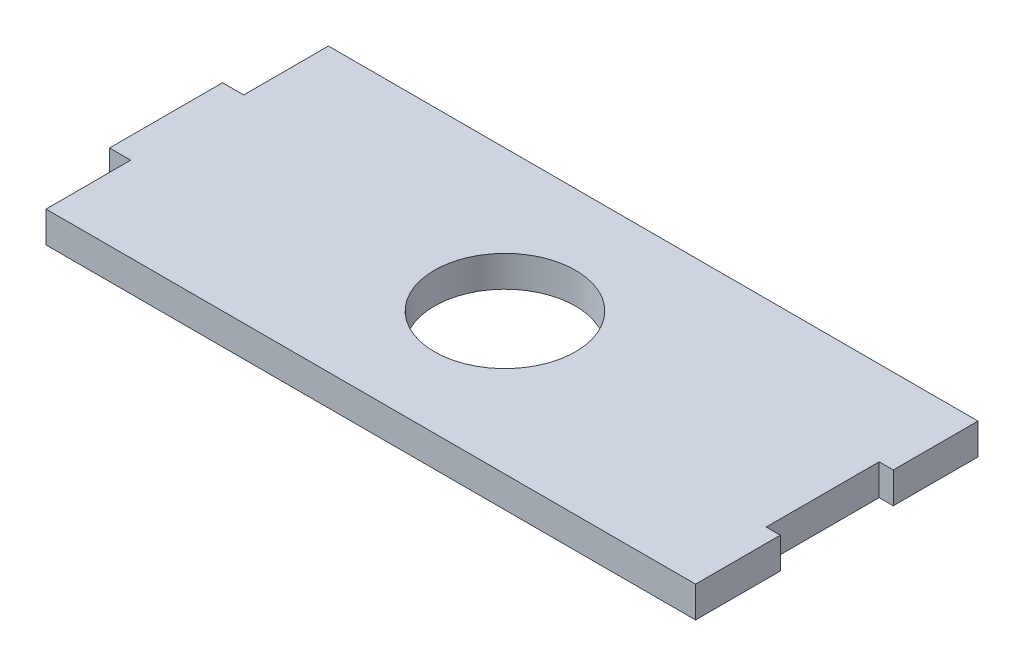
ISO-10303-21;
HEADER;
FILE_DESCRIPTION(('STEP AP214'),'2;1');
FILE_NAME('part.step','',(''),(''),'','','');
FILE_SCHEMA(('AUTOMOTIVE_DESIGN { 1 0 10303 214 1 1 1 1 }'));
ENDSEC;
DATA;
#1=APPLICATION_CONTEXT('core data for automotive mechanical design processes');
#2=APPLICATION_PROTOCOL_DEFINITION('international standard','automotive_design',2000,#1);
#3=PRODUCT_CONTEXT('',#1,'mechanical');
#4=PRODUCT('Part','Part','',(#3));
#5=PRODUCT_RELATED_PRODUCT_CATEGORY('part','',(#4));
#6=PRODUCT_DEFINITION_FORMATION('','',#4);
#7=PRODUCT_DEFINITION_CONTEXT('part definition',#1,'design');
#8=PRODUCT_DEFINITION('design','',#6,#7);
#9=PRODUCT_DEFINITION_SHAPE('','',#8);
#10=(LENGTH_UNIT() NAMED_UNIT(*) SI_UNIT(.MILLI.,.METRE.));
#11=(NAMED_UNIT(*) PLANE_ANGLE_UNIT() SI_UNIT($,.RADIAN.));
#12=(NAMED_UNIT(*) SI_UNIT($,.STERADIAN.) SOLID_ANGLE_UNIT());
#13=UNCERTAINTY_MEASURE_WITH_UNIT(LENGTH_MEASURE(1.E-05),#10,'distance_accuracy_value','');
#14=(GEOMETRIC_REPRESENTATION_CONTEXT(3) GLOBAL_UNCERTAINTY_ASSIGNED_CONTEXT((#13)) GLOBAL_UNIT_ASSIGNED_CONTEXT((#10,
#11,#12)) REPRESENTATION_CONTEXT('',''));
#15=CARTESIAN_POINT('',(0.,0.,0.));
#16=DIRECTION('',(0.,0.,1.));
#17=DIRECTION('',(1.,0.,0.));
#18=AXIS2_PLACEMENT_3D('',#15,#16,#17);
#19=CARTESIAN_POINT('',(0.,2.2,-30.5977127156326));
#20=DIRECTION('',(0.,0.,1.));
#21=DIRECTION('',(1.,0.,0.));
#22=AXIS2_PLACEMENT_3D('',#19,#20,#21);
#23=PLANE('',#22);
#24=DIRECTION('',(-1.,0.,0.));
#25=VECTOR('',#24,1.);
#26=CARTESIAN_POINT('',(0.,0.,-30.5977127156326));
#27=LINE('',#26,#25);
#28=CARTESIAN_POINT('',(-91.3045745686273,0.,-30.5977127156326));
#29=VERTEX_POINT('',#28);
#30=CARTESIAN_POINT('',(-92.3045745686274,0.,-30.5977127156326));
#31=VERTEX_POINT('',#30);
#32=EDGE_CURVE('E159',#29,#31,#27,.T.);
#33=ORIENTED_EDGE('',*,*,#32,.F.);
#34=DIRECTION('',(0.,-1.,0.));
#35=VECTOR('',#34,1.);
#36=CARTESIAN_POINT('',(-91.3045745686273,2.2,-30.5977127156326));
#37=LINE('',#36,#35);
#38=CARTESIAN_POINT('',(-91.3045745686273,2.2,-30.5977127156326));
#39=VERTEX_POINT('',#38);
#40=EDGE_CURVE('E11',#39,#29,#37,.T.);
#41=ORIENTED_EDGE('',*,*,#40,.F.);
#42=DIRECTION('',(-1.,0.,0.));
#43=VECTOR('',#42,1.);
#44=CARTESIAN_POINT('',(0.,2.2,-30.5977127156326));
#45=LINE('',#44,#43);
#46=CARTESIAN_POINT('',(-92.3045745686274,2.2,-30.5977127156326));
#47=VERTEX_POINT('',#46);
#48=EDGE_CURVE('E191',#39,#47,#45,.T.);
#49=ORIENTED_EDGE('',*,*,#48,.T.);
#50=DIRECTION('',(0.,-1.,0.));
#51=VECTOR('',#50,1.);
#52=CARTESIAN_POINT('',(-92.3045745686274,2.2,-30.5977127156326));
#53=LINE('',#52,#51);
#54=EDGE_CURVE('E53',#47,#31,#53,.T.);
#55=ORIENTED_EDGE('',*,*,#54,.T.);
#56=EDGE_LOOP('',(#33,#41,#49,#55));
#57=FACE_BOUND('',#56,.T.);
#58=ADVANCED_FACE('F37',(#57),#23,.T.);
#59=CARTESIAN_POINT('',(-91.3045745686277,2.2,-1.01368440939695E-12));
#60=DIRECTION('',(1.,0.,0.));
#61=DIRECTION('',(0.,0.,-1.));
#62=AXIS2_PLACEMENT_3D('',#59,#60,#61);
#63=PLANE('',#62);
#64=DIRECTION('',(0.,0.,1.));
#65=VECTOR('',#64,1.);
#66=CARTESIAN_POINT('',(-91.3045745686277,0.,-1.01368440939695E-12));
#67=LINE('',#66,#65);
#68=CARTESIAN_POINT('',(-91.3045745686274,0.,-36.5977127156591));
#69=VERTEX_POINT('',#68);
#70=EDGE_CURVE('E161',#69,#29,#67,.T.);
#71=ORIENTED_EDGE('',*,*,#70,.F.);
#72=DIRECTION('',(0.,-1.,0.));
#73=VECTOR('',#72,1.);
#74=CARTESIAN_POINT('',(-91.3045745686274,2.2,-36.5977127156591));
#75=LINE('',#74,#73);
#76=CARTESIAN_POINT('',(-91.3045745686274,2.2,-36.5977127156591));
#77=VERTEX_POINT('',#76);
#78=EDGE_CURVE('E45',#77,#69,#75,.T.);
#79=ORIENTED_EDGE('',*,*,#78,.F.);
#80=DIRECTION('',(0.,0.,1.));
#81=VECTOR('',#80,1.);
#82=CARTESIAN_POINT('',(-91.3045745686277,2.2,-1.01368440939695E-12));
#83=LINE('',#82,#81);
#84=EDGE_CURVE('E148',#77,#39,#83,.T.);
#85=ORIENTED_EDGE('',*,*,#84,.T.);
#86=ORIENTED_EDGE('',*,*,#40,.T.);
#87=EDGE_LOOP('',(#71,#79,#85,#86));
#88=FACE_BOUND('',#87,.T.);
#89=ADVANCED_FACE('F218',(#88),#63,.T.);
#90=CARTESIAN_POINT('',(0.,2.2,-36.5977127156591));
#91=DIRECTION('',(0.,0.,-1.));
#92=DIRECTION('',(-1.,0.,0.));
#93=AXIS2_PLACEMENT_3D('',#90,#91,#92);
#94=PLANE('',#93);
#95=DIRECTION('',(1.,0.,0.));
#96=VECTOR('',#95,1.);
#97=CARTESIAN_POINT('',(0.,0.,-36.5977127156591));
#98=LINE('',#97,#96);
#99=CARTESIAN_POINT('',(-137.30457456867,0.,-36.5977127156591));
#100=VERTEX_POINT('',#99);
#101=EDGE_CURVE('E164',#100,#69,#98,.T.);
#102=ORIENTED_EDGE('',*,*,#101,.F.);
#103=DIRECTION('',(0.,-1.,0.));
#104=VECTOR('',#103,1.);
#105=CARTESIAN_POINT('',(-137.30457456867,2.2,-36.5977127156591));
#106=LINE('',#105,#104);
#107=CARTESIAN_POINT('',(-137.30457456867,2.2,-36.5977127156591));
#108=VERTEX_POINT('',#107);
#109=EDGE_CURVE('E207',#108,#100,#106,.T.);
#110=ORIENTED_EDGE('',*,*,#109,.F.);
#111=DIRECTION('',(1.,0.,0.));
#112=VECTOR('',#111,1.);
#113=CARTESIAN_POINT('',(0.,2.2,-36.5977127156591));
#114=LINE('',#113,#112);
#115=EDGE_CURVE('E214',#108,#77,#114,.T.);
#116=ORIENTED_EDGE('',*,*,#115,.T.);
#117=ORIENTED_EDGE('',*,*,#78,.T.);
#118=EDGE_LOOP('',(#102,#110,#116,#117));
#119=FACE_BOUND('',#118,.T.);
#120=ADVANCED_FACE('F212',(#119),#94,.T.);
#121=CARTESIAN_POINT('',(-137.30457456867,2.2,0.));
#122=DIRECTION('',(1.,0.,0.));
#123=DIRECTION('',(0.,0.,-1.));
#124=AXIS2_PLACEMENT_3D('',#121,#122,#123);
#125=PLANE('',#124);
#126=DIRECTION('',(0.,0.,1.));
#127=VECTOR('',#126,1.);
#128=CARTESIAN_POINT('',(-137.30457456867,0.,0.));
#129=LINE('',#128,#127);
#130=CARTESIAN_POINT('',(-137.30457456867,0.,-30.5977127156683));
#131=VERTEX_POINT('',#130);
#132=EDGE_CURVE('E167',#100,#131,#129,.T.);
#133=ORIENTED_EDGE('',*,*,#132,.T.);
#134=DIRECTION('',(0.,-1.,0.));
#135=VECTOR('',#134,1.);
#136=CARTESIAN_POINT('',(-137.30457456867,2.2,-30.5977127156683));
#137=LINE('',#136,#135);
#138=CARTESIAN_POINT('',(-137.30457456867,2.2,-30.5977127156683));
#139=VERTEX_POINT('',#138);
#140=EDGE_CURVE('E204',#139,#131,#137,.T.);
#141=ORIENTED_EDGE('',*,*,#140,.F.);
#142=DIRECTION('',(0.,0.,1.));
#143=VECTOR('',#142,1.);
#144=CARTESIAN_POINT('',(-137.30457456867,2.2,0.));
#145=LINE('',#144,#143);
#146=EDGE_CURVE('E236',#108,#139,#145,.T.);
#147=ORIENTED_EDGE('',*,*,#146,.F.);
#148=ORIENTED_EDGE('',*,*,#109,.T.);
#149=EDGE_LOOP('',(#133,#141,#147,#148));
#150=FACE_BOUND('',#149,.T.);
#151=ADVANCED_FACE('F226',(#150),#125,.F.);
#152=CARTESIAN_POINT('',(0.,2.2,-30.5977127156683));
#153=DIRECTION('',(0.,0.,1.));
#154=DIRECTION('',(1.,0.,0.));
#155=AXIS2_PLACEMENT_3D('',#152,#153,#154);
#156=PLANE('',#155);
#157=DIRECTION('',(-1.,0.,0.));
#158=VECTOR('',#157,1.);
#159=CARTESIAN_POINT('',(0.,0.,-30.5977127156683));
#160=LINE('',#159,#158);
#161=CARTESIAN_POINT('',(-138.804574568663,0.,-30.5977127156683));
#162=VERTEX_POINT('',#161);
#163=EDGE_CURVE('E169',#131,#162,#160,.T.);
#164=ORIENTED_EDGE('',*,*,#163,.T.);
#165=DIRECTION('',(0.,-1.,0.));
#166=VECTOR('',#165,1.);
#167=CARTESIAN_POINT('',(-138.804574568663,2.2,-30.5977127156683));
#168=LINE('',#167,#166);
#169=CARTESIAN_POINT('',(-138.804574568663,2.2,-30.5977127156683));
#170=VERTEX_POINT('',#169);
#171=EDGE_CURVE('E202',#170,#162,#168,.T.);
#172=ORIENTED_EDGE('',*,*,#171,.F.);
#173=DIRECTION('',(-1.,0.,0.));
#174=VECTOR('',#173,1.);
#175=CARTESIAN_POINT('',(0.,2.2,-30.5977127156683));
#176=LINE('',#175,#174);
#177=EDGE_CURVE('E232',#139,#170,#176,.T.);
#178=ORIENTED_EDGE('',*,*,#177,.F.);
#179=ORIENTED_EDGE('',*,*,#140,.T.);
#180=EDGE_LOOP('',(#164,#172,#178,#179));
#181=FACE_BOUND('',#180,.T.);
#182=ADVANCED_FACE('F230',(#181),#156,.F.);
#183=CARTESIAN_POINT('',(-138.804574568663,2.2,0.));
#184=DIRECTION('',(-1.,0.,0.));
#185=DIRECTION('',(0.,0.,1.));
#186=AXIS2_PLACEMENT_3D('',#183,#184,#185);
#187=PLANE('',#186);
#188=DIRECTION('',(0.,0.,-1.));
#189=VECTOR('',#188,1.);
#190=CARTESIAN_POINT('',(-138.804574568663,0.,0.));
#191=LINE('',#190,#189);
#192=CARTESIAN_POINT('',(-138.804574568663,0.,-22.5977127156684));
#193=VERTEX_POINT('',#192);
#194=EDGE_CURVE('E172',#193,#162,#191,.T.);
#195=ORIENTED_EDGE('',*,*,#194,.F.);
#196=DIRECTION('',(0.,-1.,0.));
#197=VECTOR('',#196,1.);
#198=CARTESIAN_POINT('',(-138.804574568663,2.2,-22.5977127156684));
#199=LINE('',#198,#197);
#200=CARTESIAN_POINT('',(-138.804574568663,2.2,-22.5977127156684));
#201=VERTEX_POINT('',#200);
#202=EDGE_CURVE('E200',#201,#193,#199,.T.);
#203=ORIENTED_EDGE('',*,*,#202,.F.);
#204=DIRECTION('',(0.,0.,-1.));
#205=VECTOR('',#204,1.);
#206=CARTESIAN_POINT('',(-138.804574568663,2.2,0.));
#207=LINE('',#206,#205);
#208=EDGE_CURVE('E235',#201,#170,#207,.T.);
#209=ORIENTED_EDGE('',*,*,#208,.T.);
#210=ORIENTED_EDGE('',*,*,#171,.T.);
#211=EDGE_LOOP('',(#195,#203,#209,#210));
#212=FACE_BOUND('',#211,.T.);
#213=ADVANCED_FACE('F284',(#212),#187,.T.);
#214=CARTESIAN_POINT('',(0.,2.2,-22.5977127156684));
#215=DIRECTION('',(0.,0.,-1.));
#216=DIRECTION('',(-1.,0.,0.));
#217=AXIS2_PLACEMENT_3D('',#214,#215,#216);
#218=PLANE('',#217);
#219=DIRECTION('',(1.,0.,0.));
#220=VECTOR('',#219,1.);
#221=CARTESIAN_POINT('',(0.,0.,-22.5977127156684));
#222=LINE('',#221,#220);
#223=CARTESIAN_POINT('',(-137.30457456867,0.,-22.5977127156684));
#224=VERTEX_POINT('',#223);
#225=EDGE_CURVE('E175',#193,#224,#222,.T.);
#226=ORIENTED_EDGE('',*,*,#225,.T.);
#227=DIRECTION('',(0.,-1.,0.));
#228=VECTOR('',#227,1.);
#229=CARTESIAN_POINT('',(-137.30457456867,2.2,-22.5977127156684));
#230=LINE('',#229,#228);
#231=CARTESIAN_POINT('',(-137.30457456867,2.2,-22.5977127156684));
#232=VERTEX_POINT('',#231);
#233=EDGE_CURVE('E197',#232,#224,#230,.T.);
#234=ORIENTED_EDGE('',*,*,#233,.F.);
#235=DIRECTION('',(1.,0.,0.));
#236=VECTOR('',#235,1.);
#237=CARTESIAN_POINT('',(0.,2.2,-22.5977127156684));
#238=LINE('',#237,#236);
#239=EDGE_CURVE('E238',#201,#232,#238,.T.);
#240=ORIENTED_EDGE('',*,*,#239,.F.);
#241=ORIENTED_EDGE('',*,*,#202,.T.);
#242=EDGE_LOOP('',(#226,#234,#240,#241));
#243=FACE_BOUND('',#242,.T.);
#244=ADVANCED_FACE('F278',(#243),#218,.F.);
#245=CARTESIAN_POINT('',(-137.304574568671,2.2,-2.54064500120833E-12));
#246=DIRECTION('',(1.,0.,0.));
#247=DIRECTION('',(0.,0.,-1.));
#248=AXIS2_PLACEMENT_3D('',#245,#246,#247);
#249=PLANE('',#248);
#250=DIRECTION('',(0.,0.,1.));
#251=VECTOR('',#250,1.);
#252=CARTESIAN_POINT('',(-137.304574568671,0.,-2.54064500120833E-12));
#253=LINE('',#252,#251);
#254=CARTESIAN_POINT('',(-137.30457456867,0.,-16.5977127156591));
#255=VERTEX_POINT('',#254);
#256=EDGE_CURVE('E177',#224,#255,#253,.T.);
#257=ORIENTED_EDGE('',*,*,#256,.T.);
#258=DIRECTION('',(0.,-1.,0.));
#259=VECTOR('',#258,1.);
#260=CARTESIAN_POINT('',(-137.30457456867,2.2,-16.5977127156591));
#261=LINE('',#260,#259);
#262=CARTESIAN_POINT('',(-137.30457456867,2.2,-16.5977127156591));
#263=VERTEX_POINT('',#262);
#264=EDGE_CURVE('E195',#263,#255,#261,.T.);
#265=ORIENTED_EDGE('',*,*,#264,.F.);
#266=DIRECTION('',(0.,0.,1.));
#267=VECTOR('',#266,1.);
#268=CARTESIAN_POINT('',(-137.304574568671,2.2,-2.54064500120833E-12));
#269=LINE('',#268,#267);
#270=EDGE_CURVE('E243',#232,#263,#269,.T.);
#271=ORIENTED_EDGE('',*,*,#270,.F.);
#272=ORIENTED_EDGE('',*,*,#233,.T.);
#273=EDGE_LOOP('',(#257,#265,#271,#272));
#274=FACE_BOUND('',#273,.T.);
#275=ADVANCED_FACE('F274',(#274),#249,.F.);
#276=CARTESIAN_POINT('',(0.,2.2,-16.5977127156591));
#277=DIRECTION('',(0.,0.,1.));
#278=DIRECTION('',(1.,0.,0.));
#279=AXIS2_PLACEMENT_3D('',#276,#277,#278);
#280=PLANE('',#279);
#281=DIRECTION('',(-1.,0.,0.));
#282=VECTOR('',#281,1.);
#283=CARTESIAN_POINT('',(0.,0.,-16.5977127156591));
#284=LINE('',#283,#282);
#285=CARTESIAN_POINT('',(-91.3045745686274,0.,-16.5977127156591));
#286=VERTEX_POINT('',#285);
#287=EDGE_CURVE('E180',#286,#255,#284,.T.);
#288=ORIENTED_EDGE('',*,*,#287,.F.);
#289=DIRECTION('',(0.,-1.,0.));
#290=VECTOR('',#289,1.);
#291=CARTESIAN_POINT('',(-91.3045745686274,2.2,-16.5977127156591));
#292=LINE('',#291,#290);
#293=CARTESIAN_POINT('',(-91.3045745686274,2.2,-16.5977127156591));
#294=VERTEX_POINT('',#293);
#295=EDGE_CURVE('E136',#294,#286,#292,.T.);
#296=ORIENTED_EDGE('',*,*,#295,.F.);
#297=DIRECTION('',(-1.,0.,0.));
#298=VECTOR('',#297,1.);
#299=CARTESIAN_POINT('',(0.,2.2,-16.5977127156591));
#300=LINE('',#299,#298);
#301=EDGE_CURVE('E146',#294,#263,#300,.T.);
#302=ORIENTED_EDGE('',*,*,#301,.T.);
#303=ORIENTED_EDGE('',*,*,#264,.T.);
#304=EDGE_LOOP('',(#288,#296,#302,#303));
#305=FACE_BOUND('',#304,.T.);
#306=ADVANCED_FACE('F248',(#305),#280,.T.);
#307=CARTESIAN_POINT('',(-91.3045745686274,0.,-22.5977127156326));
#308=VERTEX_POINT('',#307);
#309=EDGE_CURVE('E132',#308,#286,#67,.T.);
#310=ORIENTED_EDGE('',*,*,#309,.F.);
#311=DIRECTION('',(0.,-1.,0.));
#312=VECTOR('',#311,1.);
#313=CARTESIAN_POINT('',(-91.3045745686274,2.2,-22.5977127156326));
#314=LINE('',#313,#312);
#315=CARTESIAN_POINT('',(-91.3045745686274,2.2,-22.5977127156326));
#316=VERTEX_POINT('',#315);
#317=EDGE_CURVE('E127',#316,#308,#314,.T.);
#318=ORIENTED_EDGE('',*,*,#317,.F.);
#319=EDGE_CURVE('E130',#316,#294,#83,.T.);
#320=ORIENTED_EDGE('',*,*,#319,.T.);
#321=ORIENTED_EDGE('',*,*,#295,.T.);
#322=EDGE_LOOP('',(#310,#318,#320,#321));
#323=FACE_BOUND('',#322,.T.);
#324=ADVANCED_FACE('F129',(#323),#63,.T.);
#325=CARTESIAN_POINT('',(0.,2.2,-22.5977127156326));
#326=DIRECTION('',(0.,0.,-1.));
#327=DIRECTION('',(-1.,0.,0.));
#328=AXIS2_PLACEMENT_3D('',#325,#326,#327);
#329=PLANE('',#328);
#330=DIRECTION('',(1.,0.,0.));
#331=VECTOR('',#330,1.);
#332=CARTESIAN_POINT('',(0.,0.,-22.5977127156326));
#333=LINE('',#332,#331);
#334=CARTESIAN_POINT('',(-92.3045745686274,0.,-22.5977127156326));
#335=VERTEX_POINT('',#334);
#336=EDGE_CURVE('E183',#335,#308,#333,.T.);
#337=ORIENTED_EDGE('',*,*,#336,.F.);
#338=DIRECTION('',(0.,-1.,0.));
#339=VECTOR('',#338,1.);
#340=CARTESIAN_POINT('',(-92.3045745686274,2.2,-22.5977127156326));
#341=LINE('',#340,#339);
#342=CARTESIAN_POINT('',(-92.3045745686274,2.2,-22.5977127156326));
#343=VERTEX_POINT('',#342);
#344=EDGE_CURVE('E90',#343,#335,#341,.T.);
#345=ORIENTED_EDGE('',*,*,#344,.F.);
#346=DIRECTION('',(1.,0.,0.));
#347=VECTOR('',#346,1.);
#348=CARTESIAN_POINT('',(0.,2.2,-22.5977127156326));
#349=LINE('',#348,#347);
#350=EDGE_CURVE('E144',#343,#316,#349,.T.);
#351=ORIENTED_EDGE('',*,*,#350,.T.);
#352=ORIENTED_EDGE('',*,*,#317,.T.);
#353=EDGE_LOOP('',(#337,#345,#351,#352));
#354=FACE_BOUND('',#353,.T.);
#355=ADVANCED_FACE('F149',(#354),#329,.T.);
#356=CARTESIAN_POINT('',(-92.3045745686276,2.2,-6.40491649777E-13));
#357=DIRECTION('',(1.,0.,0.));
#358=DIRECTION('',(0.,0.,-1.));
#359=AXIS2_PLACEMENT_3D('',#356,#357,#358);
#360=PLANE('',#359);
#361=DIRECTION('',(0.,0.,1.));
#362=VECTOR('',#361,1.);
#363=CARTESIAN_POINT('',(-92.3045745686276,0.,-6.40491649777E-13));
#364=LINE('',#363,#362);
#365=EDGE_CURVE('E185',#31,#335,#364,.T.);
#366=ORIENTED_EDGE('',*,*,#365,.F.);
#367=ORIENTED_EDGE('',*,*,#54,.F.);
#368=DIRECTION('',(0.,0.,1.));
#369=VECTOR('',#368,1.);
#370=CARTESIAN_POINT('',(-92.3045745686276,2.2,-6.40491649777E-13));
#371=LINE('',#370,#369);
#372=EDGE_CURVE('E150',#47,#343,#371,.T.);
#373=ORIENTED_EDGE('',*,*,#372,.T.);
#374=ORIENTED_EDGE('',*,*,#344,.T.);
#375=EDGE_LOOP('',(#366,#367,#373,#374));
#376=FACE_BOUND('',#375,.T.);
#377=ADVANCED_FACE('F250',(#376),#360,.T.);
#378=CARTESIAN_POINT('',(-114.805151385313,2.2,-26.5977127156638));
#379=DIRECTION('',(0.,-1.,0.));
#380=DIRECTION('',(0.,0.,-1.));
#381=AXIS2_PLACEMENT_3D('',#378,#379,#380);
#382=CYLINDRICAL_SURFACE('',#381,4.99999999999998);
#383=CARTESIAN_POINT('',(-114.805151385313,2.2,-26.5977127156638));
#384=DIRECTION('',(0.,1.,0.));
#385=DIRECTION('',(0.,0.,1.));
#386=AXIS2_PLACEMENT_3D('',#383,#384,#385);
#387=CIRCLE('',#386,4.99999999999998);
#388=CARTESIAN_POINT('',(-114.805151385313,2.2,-21.5977127156638));
#389=VERTEX_POINT('',#388);
#390=EDGE_CURVE('E152',#389,#389,#387,.F.);
#391=ORIENTED_EDGE('',*,*,#390,.F.);
#392=EDGE_LOOP('',(#391));
#393=FACE_BOUND('',#392,.T.);
#394=CARTESIAN_POINT('',(-114.805151385313,0.,-26.5977127156638));
#395=DIRECTION('',(0.,1.,0.));
#396=DIRECTION('',(0.,0.,1.));
#397=AXIS2_PLACEMENT_3D('',#394,#395,#396);
#398=CIRCLE('',#397,4.99999999999998);
#399=CARTESIAN_POINT('',(-114.805151385313,0.,-21.5977127156638));
#400=VERTEX_POINT('',#399);
#401=EDGE_CURVE('E188',#400,#400,#398,.F.);
#402=ORIENTED_EDGE('',*,*,#401,.T.);
#403=EDGE_LOOP('',(#402));
#404=FACE_BOUND('',#403,.T.);
#405=ADVANCED_FACE('F252',(#393,#404),#382,.F.);
#406=CARTESIAN_POINT('',(0.,2.2,0.));
#407=DIRECTION('',(0.,1.,0.));
#408=DIRECTION('',(0.,0.,1.));
#409=AXIS2_PLACEMENT_3D('',#406,#407,#408);
#410=PLANE('',#409);
#411=ORIENTED_EDGE('',*,*,#48,.F.);
#412=ORIENTED_EDGE('',*,*,#84,.F.);
#413=ORIENTED_EDGE('',*,*,#115,.F.);
#414=ORIENTED_EDGE('',*,*,#146,.T.);
#415=ORIENTED_EDGE('',*,*,#177,.T.);
#416=ORIENTED_EDGE('',*,*,#208,.F.);
#417=ORIENTED_EDGE('',*,*,#239,.T.);
#418=ORIENTED_EDGE('',*,*,#270,.T.);
#419=ORIENTED_EDGE('',*,*,#301,.F.);
#420=ORIENTED_EDGE('',*,*,#319,.F.);
#421=ORIENTED_EDGE('',*,*,#350,.F.);
#422=ORIENTED_EDGE('',*,*,#372,.F.);
#423=EDGE_LOOP('',(#411,#412,#413,#414,#415,#416,#417,#418,#419,#420,#421,#422));
#424=FACE_BOUND('',#423,.T.);
#425=ORIENTED_EDGE('',*,*,#390,.T.);
#426=EDGE_LOOP('',(#425));
#427=FACE_BOUND('',#426,.T.);
#428=ADVANCED_FACE('F141',(#424,#427),#410,.T.);
#429=CARTESIAN_POINT('',(0.,0.,0.));
#430=DIRECTION('',(0.,1.,0.));
#431=DIRECTION('',(0.,0.,1.));
#432=AXIS2_PLACEMENT_3D('',#429,#430,#431);
#433=PLANE('',#432);
#434=ORIENTED_EDGE('',*,*,#32,.T.);
#435=ORIENTED_EDGE('',*,*,#365,.T.);
#436=ORIENTED_EDGE('',*,*,#336,.T.);
#437=ORIENTED_EDGE('',*,*,#309,.T.);
#438=ORIENTED_EDGE('',*,*,#287,.T.);
#439=ORIENTED_EDGE('',*,*,#256,.F.);
#440=ORIENTED_EDGE('',*,*,#225,.F.);
#441=ORIENTED_EDGE('',*,*,#194,.T.);
#442=ORIENTED_EDGE('',*,*,#163,.F.);
#443=ORIENTED_EDGE('',*,*,#132,.F.);
#444=ORIENTED_EDGE('',*,*,#101,.T.);
#445=ORIENTED_EDGE('',*,*,#70,.T.);
#446=EDGE_LOOP('',(#434,#435,#436,#437,#438,#439,#440,#441,#442,#443,#444,#445));
#447=FACE_BOUND('',#446,.T.);
#448=ORIENTED_EDGE('',*,*,#401,.F.);
#449=EDGE_LOOP('',(#448));
#450=FACE_BOUND('',#449,.T.);
#451=ADVANCED_FACE('F221',(#447,#450),#433,.F.);
#452=CLOSED_SHELL('',(#58,#89,#120,#151,#182,#213,#244,#275,#306,#324,#355,#377,#405,#428,#451));
#453=MANIFOLD_SOLID_BREP('B2',#452);
#454=ADVANCED_BREP_SHAPE_REPRESENTATION('',(#18,#453),#14);
#455=SHAPE_DEFINITION_REPRESENTATION(#9,#454);
ENDSEC;
END-ISO-10303-21;
